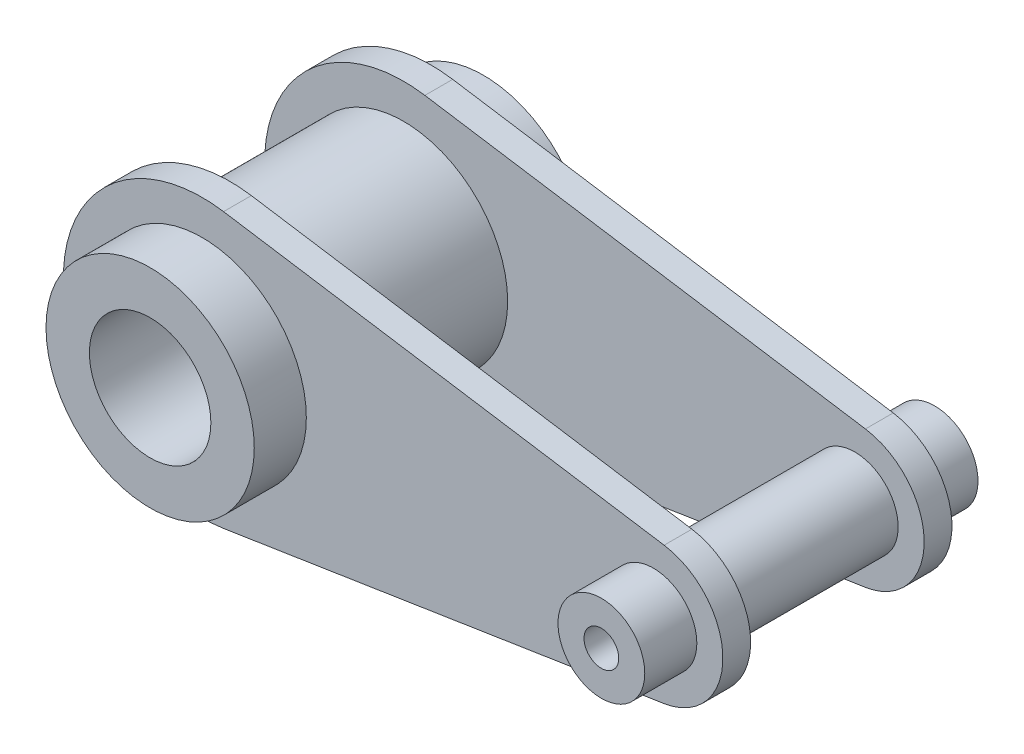
ISO-10303-21;
HEADER;
FILE_DESCRIPTION(('STEP AP214'),'2;1');
FILE_NAME('part.step','',(''),(''),'','','');
FILE_SCHEMA(('AUTOMOTIVE_DESIGN { 1 0 10303 214 1 1 1 1 }'));
ENDSEC;
DATA;
#1=APPLICATION_CONTEXT('core data for automotive mechanical design processes');
#2=APPLICATION_PROTOCOL_DEFINITION('international standard','automotive_design',2000,#1);
#3=PRODUCT_CONTEXT('',#1,'mechanical');
#4=PRODUCT('Part','Part','',(#3));
#5=PRODUCT_RELATED_PRODUCT_CATEGORY('part','',(#4));
#6=PRODUCT_DEFINITION_FORMATION('','',#4);
#7=PRODUCT_DEFINITION_CONTEXT('part definition',#1,'design');
#8=PRODUCT_DEFINITION('design','',#6,#7);
#9=PRODUCT_DEFINITION_SHAPE('','',#8);
#10=(LENGTH_UNIT() NAMED_UNIT(*) SI_UNIT(.MILLI.,.METRE.));
#11=(NAMED_UNIT(*) PLANE_ANGLE_UNIT() SI_UNIT($,.RADIAN.));
#12=(NAMED_UNIT(*) SI_UNIT($,.STERADIAN.) SOLID_ANGLE_UNIT());
#13=UNCERTAINTY_MEASURE_WITH_UNIT(LENGTH_MEASURE(1.E-05),#10,'distance_accuracy_value','');
#14=(GEOMETRIC_REPRESENTATION_CONTEXT(3) GLOBAL_UNCERTAINTY_ASSIGNED_CONTEXT((#13)) GLOBAL_UNIT_ASSIGNED_CONTEXT((#10,
#11,#12)) REPRESENTATION_CONTEXT('',''));
#15=CARTESIAN_POINT('',(0.,0.,0.));
#16=DIRECTION('',(0.,0.,1.));
#17=DIRECTION('',(1.,0.,0.));
#18=AXIS2_PLACEMENT_3D('',#15,#16,#17);
#19=CARTESIAN_POINT('',(-65.,0.,48.));
#20=DIRECTION('',(0.,0.,-1.));
#21=DIRECTION('',(-1.,0.,0.));
#22=AXIS2_PLACEMENT_3D('',#19,#20,#21);
#23=CYLINDRICAL_SURFACE('',#22,30.);
#24=CARTESIAN_POINT('',(-65.,0.,25.));
#25=DIRECTION('',(0.,0.,1.));
#26=DIRECTION('',(1.,0.,0.));
#27=AXIS2_PLACEMENT_3D('',#24,#25,#26);
#28=CIRCLE('',#27,30.);
#29=CARTESIAN_POINT('',(-35.,0.,25.));
#30=VERTEX_POINT('',#29);
#31=EDGE_CURVE('E220',#30,#30,#28,.T.);
#32=ORIENTED_EDGE('',*,*,#31,.F.);
#33=EDGE_LOOP('',(#32));
#34=FACE_BOUND('',#33,.T.);
#35=CARTESIAN_POINT('',(-65.,0.,-25.));
#36=DIRECTION('',(0.,0.,-1.));
#37=DIRECTION('',(-1.,0.,0.));
#38=AXIS2_PLACEMENT_3D('',#35,#36,#37);
#39=CIRCLE('',#38,30.);
#40=CARTESIAN_POINT('',(-95.,0.,-25.));
#41=VERTEX_POINT('',#40);
#42=EDGE_CURVE('E13',#41,#41,#39,.T.);
#43=ORIENTED_EDGE('',*,*,#42,.F.);
#44=EDGE_LOOP('',(#43));
#45=FACE_BOUND('',#44,.T.);
#46=ADVANCED_FACE('F44',(#34,#45),#23,.T.);
#47=CARTESIAN_POINT('',(65.,0.,48.));
#48=DIRECTION('',(0.,0.,-1.));
#49=DIRECTION('',(-1.,0.,0.));
#50=AXIS2_PLACEMENT_3D('',#47,#48,#49);
#51=CYLINDRICAL_SURFACE('',#50,12.5);
#52=CARTESIAN_POINT('',(65.,0.,25.));
#53=DIRECTION('',(0.,0.,1.));
#54=DIRECTION('',(1.,0.,0.));
#55=AXIS2_PLACEMENT_3D('',#52,#53,#54);
#56=CIRCLE('',#55,12.5);
#57=CARTESIAN_POINT('',(77.5,0.,25.));
#58=VERTEX_POINT('',#57);
#59=EDGE_CURVE('E175',#58,#58,#56,.F.);
#60=ORIENTED_EDGE('',*,*,#59,.T.);
#61=EDGE_LOOP('',(#60));
#62=FACE_BOUND('',#61,.T.);
#63=CARTESIAN_POINT('',(65.,0.,-25.));
#64=DIRECTION('',(0.,0.,-1.));
#65=DIRECTION('',(-1.,0.,0.));
#66=AXIS2_PLACEMENT_3D('',#63,#64,#65);
#67=CIRCLE('',#66,12.5);
#68=CARTESIAN_POINT('',(52.5,0.,-25.));
#69=VERTEX_POINT('',#68);
#70=EDGE_CURVE('E53',#69,#69,#67,.T.);
#71=ORIENTED_EDGE('',*,*,#70,.F.);
#72=EDGE_LOOP('',(#71));
#73=FACE_BOUND('',#72,.T.);
#74=ADVANCED_FACE('F228',(#62,#73),#51,.T.);
#75=CARTESIAN_POINT('',(-65.,0.,-33.));
#76=DIRECTION('',(0.,0.,1.));
#77=DIRECTION('',(1.,0.,0.));
#78=AXIS2_PLACEMENT_3D('',#75,#76,#77);
#79=CIRCLE('',#78,30.);
#80=CARTESIAN_POINT('',(-35.,0.,-33.));
#81=VERTEX_POINT('',#80);
#82=EDGE_CURVE('E151',#81,#81,#79,.T.);
#83=ORIENTED_EDGE('',*,*,#82,.F.);
#84=EDGE_LOOP('',(#83));
#85=FACE_BOUND('',#84,.T.);
#86=CARTESIAN_POINT('',(-65.,0.,-48.));
#87=DIRECTION('',(0.,0.,1.));
#88=DIRECTION('',(1.,0.,0.));
#89=AXIS2_PLACEMENT_3D('',#86,#87,#88);
#90=CIRCLE('',#89,30.);
#91=CARTESIAN_POINT('',(-35.,0.,-48.));
#92=VERTEX_POINT('',#91);
#93=EDGE_CURVE('E214',#92,#92,#90,.T.);
#94=ORIENTED_EDGE('',*,*,#93,.T.);
#95=EDGE_LOOP('',(#94));
#96=FACE_BOUND('',#95,.T.);
#97=ADVANCED_FACE('F230',(#85,#96),#23,.T.);
#98=CARTESIAN_POINT('',(-65.,0.,48.));
#99=DIRECTION('',(0.,0.,1.));
#100=DIRECTION('',(1.,0.,0.));
#101=AXIS2_PLACEMENT_3D('',#98,#99,#100);
#102=PLANE('',#101);
#103=CARTESIAN_POINT('',(-65.,0.,48.));
#104=DIRECTION('',(0.,0.,1.));
#105=DIRECTION('',(1.,0.,0.));
#106=AXIS2_PLACEMENT_3D('',#103,#104,#105);
#107=CIRCLE('',#106,30.);
#108=CARTESIAN_POINT('',(-35.,0.,48.));
#109=VERTEX_POINT('',#108);
#110=EDGE_CURVE('E217',#109,#109,#107,.T.);
#111=ORIENTED_EDGE('',*,*,#110,.T.);
#112=EDGE_LOOP('',(#111));
#113=FACE_BOUND('',#112,.T.);
#114=CARTESIAN_POINT('',(-65.,0.,48.));
#115=DIRECTION('',(0.,0.,1.));
#116=DIRECTION('',(1.,0.,0.));
#117=AXIS2_PLACEMENT_3D('',#114,#115,#116);
#118=CIRCLE('',#117,17.5);
#119=CARTESIAN_POINT('',(-47.5,0.,48.));
#120=VERTEX_POINT('',#119);
#121=EDGE_CURVE('E211',#120,#120,#118,.T.);
#122=ORIENTED_EDGE('',*,*,#121,.F.);
#123=EDGE_LOOP('',(#122));
#124=FACE_BOUND('',#123,.T.);
#125=ADVANCED_FACE('F239',(#113,#124),#102,.T.);
#126=CARTESIAN_POINT('',(-65.,0.,-48.));
#127=DIRECTION('',(0.,0.,1.));
#128=DIRECTION('',(1.,0.,0.));
#129=AXIS2_PLACEMENT_3D('',#126,#127,#128);
#130=PLANE('',#129);
#131=ORIENTED_EDGE('',*,*,#93,.F.);
#132=EDGE_LOOP('',(#131));
#133=FACE_BOUND('',#132,.T.);
#134=CARTESIAN_POINT('',(-65.,0.,-48.));
#135=DIRECTION('',(0.,0.,1.));
#136=DIRECTION('',(1.,0.,0.));
#137=AXIS2_PLACEMENT_3D('',#134,#135,#136);
#138=CIRCLE('',#137,17.5);
#139=CARTESIAN_POINT('',(-47.5,0.,-48.));
#140=VERTEX_POINT('',#139);
#141=EDGE_CURVE('E206',#140,#140,#138,.T.);
#142=ORIENTED_EDGE('',*,*,#141,.T.);
#143=EDGE_LOOP('',(#142));
#144=FACE_BOUND('',#143,.T.);
#145=ADVANCED_FACE('F428',(#133,#144),#130,.F.);
#146=CARTESIAN_POINT('',(-65.,0.,33.));
#147=DIRECTION('',(0.,0.,1.));
#148=DIRECTION('',(1.,0.,0.));
#149=AXIS2_PLACEMENT_3D('',#146,#147,#148);
#150=CIRCLE('',#149,30.);
#151=CARTESIAN_POINT('',(-35.,0.,33.));
#152=VERTEX_POINT('',#151);
#153=EDGE_CURVE('E183',#152,#152,#150,.T.);
#154=ORIENTED_EDGE('',*,*,#153,.T.);
#155=EDGE_LOOP('',(#154));
#156=FACE_BOUND('',#155,.T.);
#157=ORIENTED_EDGE('',*,*,#110,.F.);
#158=EDGE_LOOP('',(#157));
#159=FACE_BOUND('',#158,.T.);
#160=ADVANCED_FACE('F46',(#156,#159),#23,.T.);
#161=CARTESIAN_POINT('',(-65.,0.,48.));
#162=DIRECTION('',(0.,0.,-1.));
#163=DIRECTION('',(-1.,0.,0.));
#164=AXIS2_PLACEMENT_3D('',#161,#162,#163);
#165=CYLINDRICAL_SURFACE('',#164,17.5);
#166=ORIENTED_EDGE('',*,*,#121,.T.);
#167=EDGE_LOOP('',(#166));
#168=FACE_BOUND('',#167,.T.);
#169=ORIENTED_EDGE('',*,*,#141,.F.);
#170=EDGE_LOOP('',(#169));
#171=FACE_BOUND('',#170,.T.);
#172=ADVANCED_FACE('F386',(#168,#171),#165,.F.);
#173=CARTESIAN_POINT('',(-65.,0.,25.));
#174=DIRECTION('',(0.,0.,1.));
#175=DIRECTION('',(1.,0.,0.));
#176=AXIS2_PLACEMENT_3D('',#173,#174,#175);
#177=CYLINDRICAL_SURFACE('',#176,40.);
#178=CARTESIAN_POINT('',(-65.,0.,33.));
#179=DIRECTION('',(0.,0.,1.));
#180=DIRECTION('',(1.,0.,0.));
#181=AXIS2_PLACEMENT_3D('',#178,#179,#180);
#182=CIRCLE('',#181,40.);
#183=CARTESIAN_POINT('',(-58.8461538461539,39.5237925497389,33.));
#184=VERTEX_POINT('',#183);
#185=CARTESIAN_POINT('',(-58.8461538461538,-39.5237925497389,33.));
#186=VERTEX_POINT('',#185);
#187=EDGE_CURVE('E186',#184,#186,#182,.T.);
#188=ORIENTED_EDGE('',*,*,#187,.F.);
#189=DIRECTION('',(0.,0.,1.));
#190=VECTOR('',#189,1.);
#191=CARTESIAN_POINT('',(-58.8461538461539,39.5237925497389,25.));
#192=LINE('',#191,#190);
#193=CARTESIAN_POINT('',(-58.8461538461539,39.5237925497389,25.));
#194=VERTEX_POINT('',#193);
#195=EDGE_CURVE('E61',#194,#184,#192,.T.);
#196=ORIENTED_EDGE('',*,*,#195,.F.);
#197=CARTESIAN_POINT('',(-65.,0.,25.));
#198=DIRECTION('',(0.,0.,1.));
#199=DIRECTION('',(1.,0.,0.));
#200=AXIS2_PLACEMENT_3D('',#197,#198,#199);
#201=CIRCLE('',#200,40.);
#202=CARTESIAN_POINT('',(-58.8461538461538,-39.5237925497389,25.));
#203=VERTEX_POINT('',#202);
#204=EDGE_CURVE('E187',#194,#203,#201,.T.);
#205=ORIENTED_EDGE('',*,*,#204,.T.);
#206=DIRECTION('',(0.,0.,1.));
#207=VECTOR('',#206,1.);
#208=CARTESIAN_POINT('',(-58.8461538461538,-39.5237925497389,25.));
#209=LINE('',#208,#207);
#210=EDGE_CURVE('E90',#203,#186,#209,.T.);
#211=ORIENTED_EDGE('',*,*,#210,.T.);
#212=EDGE_LOOP('',(#188,#196,#205,#211));
#213=FACE_BOUND('',#212,.T.);
#214=ADVANCED_FACE('F378',(#213),#177,.T.);
#215=CARTESIAN_POINT('',(68.0769230769231,19.7618962748695,25.));
#216=DIRECTION('',(0.153846153846154,0.988094813743472,0.));
#217=DIRECTION('',(-0.988094813743472,0.153846153846154,0.));
#218=AXIS2_PLACEMENT_3D('',#215,#216,#217);
#219=PLANE('',#218);
#220=DIRECTION('',(-0.988094813743472,0.153846153846154,0.));
#221=VECTOR('',#220,1.);
#222=CARTESIAN_POINT('',(68.0769230769231,19.7618962748695,33.));
#223=LINE('',#222,#221);
#224=CARTESIAN_POINT('',(68.0769230769231,19.7618962748695,33.));
#225=VERTEX_POINT('',#224);
#226=EDGE_CURVE('E190',#225,#184,#223,.T.);
#227=ORIENTED_EDGE('',*,*,#226,.F.);
#228=DIRECTION('',(0.,0.,1.));
#229=VECTOR('',#228,1.);
#230=CARTESIAN_POINT('',(68.0769230769231,19.7618962748695,25.));
#231=LINE('',#230,#229);
#232=CARTESIAN_POINT('',(68.0769230769231,19.7618962748695,25.));
#233=VERTEX_POINT('',#232);
#234=EDGE_CURVE('E79',#233,#225,#231,.T.);
#235=ORIENTED_EDGE('',*,*,#234,.F.);
#236=DIRECTION('',(-0.988094813743472,0.153846153846154,0.));
#237=VECTOR('',#236,1.);
#238=CARTESIAN_POINT('',(68.0769230769231,19.7618962748695,25.));
#239=LINE('',#238,#237);
#240=EDGE_CURVE('E194',#233,#194,#239,.T.);
#241=ORIENTED_EDGE('',*,*,#240,.T.);
#242=ORIENTED_EDGE('',*,*,#195,.T.);
#243=EDGE_LOOP('',(#227,#235,#241,#242));
#244=FACE_BOUND('',#243,.T.);
#245=ADVANCED_FACE('F370',(#244),#219,.T.);
#246=CARTESIAN_POINT('',(65.,0.,25.));
#247=DIRECTION('',(0.,0.,1.));
#248=DIRECTION('',(1.,0.,0.));
#249=AXIS2_PLACEMENT_3D('',#246,#247,#248);
#250=CYLINDRICAL_SURFACE('',#249,20.);
#251=CARTESIAN_POINT('',(65.,0.,33.));
#252=DIRECTION('',(0.,0.,1.));
#253=DIRECTION('',(1.,0.,0.));
#254=AXIS2_PLACEMENT_3D('',#251,#252,#253);
#255=CIRCLE('',#254,20.);
#256=CARTESIAN_POINT('',(68.0769230769231,-19.7618962748694,33.));
#257=VERTEX_POINT('',#256);
#258=EDGE_CURVE('E201',#257,#225,#255,.T.);
#259=ORIENTED_EDGE('',*,*,#258,.F.);
#260=DIRECTION('',(0.,0.,1.));
#261=VECTOR('',#260,1.);
#262=CARTESIAN_POINT('',(68.0769230769231,-19.7618962748694,25.));
#263=LINE('',#262,#261);
#264=CARTESIAN_POINT('',(68.0769230769231,-19.7618962748694,25.));
#265=VERTEX_POINT('',#264);
#266=EDGE_CURVE('E208',#265,#257,#263,.T.);
#267=ORIENTED_EDGE('',*,*,#266,.F.);
#268=CARTESIAN_POINT('',(65.,0.,25.));
#269=DIRECTION('',(0.,0.,1.));
#270=DIRECTION('',(1.,0.,0.));
#271=AXIS2_PLACEMENT_3D('',#268,#269,#270);
#272=CIRCLE('',#271,20.);
#273=EDGE_CURVE('E192',#265,#233,#272,.T.);
#274=ORIENTED_EDGE('',*,*,#273,.T.);
#275=ORIENTED_EDGE('',*,*,#234,.T.);
#276=EDGE_LOOP('',(#259,#267,#274,#275));
#277=FACE_BOUND('',#276,.T.);
#278=ADVANCED_FACE('F362',(#277),#250,.T.);
#279=CARTESIAN_POINT('',(68.0769230769231,-19.7618962748694,25.));
#280=DIRECTION('',(0.153846153846154,-0.988094813743472,0.));
#281=DIRECTION('',(0.988094813743471,0.153846153846154,0.));
#282=AXIS2_PLACEMENT_3D('',#279,#280,#281);
#283=PLANE('',#282);
#284=DIRECTION('',(0.988094813743471,0.153846153846154,0.));
#285=VECTOR('',#284,1.);
#286=CARTESIAN_POINT('',(68.0769230769231,-19.7618962748694,33.));
#287=LINE('',#286,#285);
#288=EDGE_CURVE('E198',#186,#257,#287,.T.);
#289=ORIENTED_EDGE('',*,*,#288,.F.);
#290=ORIENTED_EDGE('',*,*,#210,.F.);
#291=DIRECTION('',(0.988094813743471,0.153846153846154,0.));
#292=VECTOR('',#291,1.);
#293=CARTESIAN_POINT('',(68.0769230769231,-19.7618962748694,25.));
#294=LINE('',#293,#292);
#295=EDGE_CURVE('E189',#203,#265,#294,.T.);
#296=ORIENTED_EDGE('',*,*,#295,.T.);
#297=ORIENTED_EDGE('',*,*,#266,.T.);
#298=EDGE_LOOP('',(#289,#290,#296,#297));
#299=FACE_BOUND('',#298,.T.);
#300=ADVANCED_FACE('F354',(#299),#283,.T.);
#301=CARTESIAN_POINT('',(-65.,0.,25.));
#302=DIRECTION('',(0.,0.,1.));
#303=DIRECTION('',(1.,0.,0.));
#304=AXIS2_PLACEMENT_3D('',#301,#302,#303);
#305=PLANE('',#304);
#306=ORIENTED_EDGE('',*,*,#59,.F.);
#307=EDGE_LOOP('',(#306));
#308=FACE_BOUND('',#307,.T.);
#309=ORIENTED_EDGE('',*,*,#31,.T.);
#310=EDGE_LOOP('',(#309));
#311=FACE_BOUND('',#310,.T.);
#312=ORIENTED_EDGE('',*,*,#204,.F.);
#313=ORIENTED_EDGE('',*,*,#240,.F.);
#314=ORIENTED_EDGE('',*,*,#273,.F.);
#315=ORIENTED_EDGE('',*,*,#295,.F.);
#316=EDGE_LOOP('',(#312,#313,#314,#315));
#317=FACE_BOUND('',#316,.T.);
#318=ADVANCED_FACE('F345',(#308,#311,#317),#305,.F.);
#319=CARTESIAN_POINT('',(-65.,0.,33.));
#320=DIRECTION('',(0.,0.,1.));
#321=DIRECTION('',(1.,0.,0.));
#322=AXIS2_PLACEMENT_3D('',#319,#320,#321);
#323=PLANE('',#322);
#324=CARTESIAN_POINT('',(65.,0.,33.));
#325=DIRECTION('',(0.,0.,1.));
#326=DIRECTION('',(1.,0.,0.));
#327=AXIS2_PLACEMENT_3D('',#324,#325,#326);
#328=CIRCLE('',#327,12.5);
#329=CARTESIAN_POINT('',(77.5,0.,33.));
#330=VERTEX_POINT('',#329);
#331=EDGE_CURVE('E180',#330,#330,#328,.T.);
#332=ORIENTED_EDGE('',*,*,#331,.F.);
#333=EDGE_LOOP('',(#332));
#334=FACE_BOUND('',#333,.T.);
#335=ORIENTED_EDGE('',*,*,#153,.F.);
#336=EDGE_LOOP('',(#335));
#337=FACE_BOUND('',#336,.T.);
#338=ORIENTED_EDGE('',*,*,#187,.T.);
#339=ORIENTED_EDGE('',*,*,#288,.T.);
#340=ORIENTED_EDGE('',*,*,#258,.T.);
#341=ORIENTED_EDGE('',*,*,#226,.T.);
#342=EDGE_LOOP('',(#338,#339,#340,#341));
#343=FACE_BOUND('',#342,.T.);
#344=ADVANCED_FACE('F246',(#334,#337,#343),#323,.T.);
#345=CARTESIAN_POINT('',(65.,0.,-33.));
#346=DIRECTION('',(0.,0.,1.));
#347=DIRECTION('',(1.,0.,0.));
#348=AXIS2_PLACEMENT_3D('',#345,#346,#347);
#349=CIRCLE('',#348,12.5);
#350=CARTESIAN_POINT('',(77.5,0.,-33.));
#351=VERTEX_POINT('',#350);
#352=EDGE_CURVE('E484',#351,#351,#349,.T.);
#353=ORIENTED_EDGE('',*,*,#352,.F.);
#354=EDGE_LOOP('',(#353));
#355=FACE_BOUND('',#354,.T.);
#356=CARTESIAN_POINT('',(65.,0.,-48.));
#357=DIRECTION('',(0.,0.,1.));
#358=DIRECTION('',(1.,0.,0.));
#359=AXIS2_PLACEMENT_3D('',#356,#357,#358);
#360=CIRCLE('',#359,12.5);
#361=CARTESIAN_POINT('',(77.5,0.,-48.));
#362=VERTEX_POINT('',#361);
#363=EDGE_CURVE('E169',#362,#362,#360,.T.);
#364=ORIENTED_EDGE('',*,*,#363,.T.);
#365=EDGE_LOOP('',(#364));
#366=FACE_BOUND('',#365,.T.);
#367=ADVANCED_FACE('F233',(#355,#366),#51,.T.);
#368=CARTESIAN_POINT('',(65.,0.,48.));
#369=DIRECTION('',(0.,0.,1.));
#370=DIRECTION('',(1.,0.,0.));
#371=AXIS2_PLACEMENT_3D('',#368,#369,#370);
#372=PLANE('',#371);
#373=CARTESIAN_POINT('',(65.,0.,48.));
#374=DIRECTION('',(0.,0.,1.));
#375=DIRECTION('',(1.,0.,0.));
#376=AXIS2_PLACEMENT_3D('',#373,#374,#375);
#377=CIRCLE('',#376,12.5);
#378=CARTESIAN_POINT('',(77.5,0.,48.));
#379=VERTEX_POINT('',#378);
#380=EDGE_CURVE('E172',#379,#379,#377,.T.);
#381=ORIENTED_EDGE('',*,*,#380,.T.);
#382=EDGE_LOOP('',(#381));
#383=FACE_BOUND('',#382,.T.);
#384=CARTESIAN_POINT('',(65.,0.,48.));
#385=DIRECTION('',(0.,0.,1.));
#386=DIRECTION('',(1.,0.,0.));
#387=AXIS2_PLACEMENT_3D('',#384,#385,#386);
#388=CIRCLE('',#387,5.);
#389=CARTESIAN_POINT('',(70.,0.,48.));
#390=VERTEX_POINT('',#389);
#391=EDGE_CURVE('E166',#390,#390,#388,.T.);
#392=ORIENTED_EDGE('',*,*,#391,.F.);
#393=EDGE_LOOP('',(#392));
#394=FACE_BOUND('',#393,.T.);
#395=ADVANCED_FACE('F245',(#383,#394),#372,.T.);
#396=CARTESIAN_POINT('',(65.,0.,-48.));
#397=DIRECTION('',(0.,0.,1.));
#398=DIRECTION('',(1.,0.,0.));
#399=AXIS2_PLACEMENT_3D('',#396,#397,#398);
#400=PLANE('',#399);
#401=ORIENTED_EDGE('',*,*,#363,.F.);
#402=EDGE_LOOP('',(#401));
#403=FACE_BOUND('',#402,.T.);
#404=CARTESIAN_POINT('',(65.,0.,-48.));
#405=DIRECTION('',(0.,0.,1.));
#406=DIRECTION('',(1.,0.,0.));
#407=AXIS2_PLACEMENT_3D('',#404,#405,#406);
#408=CIRCLE('',#407,5.);
#409=CARTESIAN_POINT('',(70.,0.,-48.));
#410=VERTEX_POINT('',#409);
#411=EDGE_CURVE('E161',#410,#410,#408,.T.);
#412=ORIENTED_EDGE('',*,*,#411,.T.);
#413=EDGE_LOOP('',(#412));
#414=FACE_BOUND('',#413,.T.);
#415=ADVANCED_FACE('F250',(#403,#414),#400,.F.);
#416=ORIENTED_EDGE('',*,*,#331,.T.);
#417=EDGE_LOOP('',(#416));
#418=FACE_BOUND('',#417,.T.);
#419=ORIENTED_EDGE('',*,*,#380,.F.);
#420=EDGE_LOOP('',(#419));
#421=FACE_BOUND('',#420,.T.);
#422=ADVANCED_FACE('F234',(#418,#421),#51,.T.);
#423=CARTESIAN_POINT('',(65.,0.,48.));
#424=DIRECTION('',(0.,0.,-1.));
#425=DIRECTION('',(-1.,0.,0.));
#426=AXIS2_PLACEMENT_3D('',#423,#424,#425);
#427=CYLINDRICAL_SURFACE('',#426,5.);
#428=ORIENTED_EDGE('',*,*,#391,.T.);
#429=EDGE_LOOP('',(#428));
#430=FACE_BOUND('',#429,.T.);
#431=ORIENTED_EDGE('',*,*,#411,.F.);
#432=EDGE_LOOP('',(#431));
#433=FACE_BOUND('',#432,.T.);
#434=ADVANCED_FACE('F249',(#430,#433),#427,.F.);
#435=CARTESIAN_POINT('',(-65.,0.,-25.));
#436=DIRECTION('',(0.,0.,-1.));
#437=DIRECTION('',(1.,0.,0.));
#438=AXIS2_PLACEMENT_3D('',#435,#436,#437);
#439=PLANE('',#438);
#440=CARTESIAN_POINT('',(-65.,0.,-25.));
#441=DIRECTION('',(0.,0.,1.));
#442=DIRECTION('',(1.,0.,0.));
#443=AXIS2_PLACEMENT_3D('',#440,#441,#442);
#444=CIRCLE('',#443,40.);
#445=CARTESIAN_POINT('',(-58.8461538461539,39.5237925497389,-25.));
#446=VERTEX_POINT('',#445);
#447=CARTESIAN_POINT('',(-58.8461538461538,-39.5237925497389,-25.));
#448=VERTEX_POINT('',#447);
#449=EDGE_CURVE('E124',#446,#448,#444,.T.);
#450=ORIENTED_EDGE('',*,*,#449,.T.);
#451=DIRECTION('',(0.988094813743471,0.153846153846154,0.));
#452=VECTOR('',#451,1.);
#453=CARTESIAN_POINT('',(68.0769230769231,-19.7618962748694,-25.));
#454=LINE('',#453,#452);
#455=CARTESIAN_POINT('',(68.0769230769231,-19.7618962748694,-25.));
#456=VERTEX_POINT('',#455);
#457=EDGE_CURVE('E141',#448,#456,#454,.T.);
#458=ORIENTED_EDGE('',*,*,#457,.T.);
#459=CARTESIAN_POINT('',(65.,0.,-25.));
#460=DIRECTION('',(0.,0.,1.));
#461=DIRECTION('',(1.,0.,0.));
#462=AXIS2_PLACEMENT_3D('',#459,#460,#461);
#463=CIRCLE('',#462,20.);
#464=CARTESIAN_POINT('',(68.0769230769231,19.7618962748695,-25.));
#465=VERTEX_POINT('',#464);
#466=EDGE_CURVE('E127',#456,#465,#463,.T.);
#467=ORIENTED_EDGE('',*,*,#466,.T.);
#468=DIRECTION('',(-0.988094813743472,0.153846153846154,0.));
#469=VECTOR('',#468,1.);
#470=CARTESIAN_POINT('',(68.0769230769231,19.7618962748695,-25.));
#471=LINE('',#470,#469);
#472=EDGE_CURVE('E119',#465,#446,#471,.T.);
#473=ORIENTED_EDGE('',*,*,#472,.T.);
#474=EDGE_LOOP('',(#450,#458,#467,#473));
#475=FACE_BOUND('',#474,.T.);
#476=ORIENTED_EDGE('',*,*,#42,.T.);
#477=EDGE_LOOP('',(#476));
#478=FACE_BOUND('',#477,.T.);
#479=ORIENTED_EDGE('',*,*,#70,.T.);
#480=EDGE_LOOP('',(#479));
#481=FACE_BOUND('',#480,.T.);
#482=ADVANCED_FACE('F121',(#475,#478,#481),#439,.F.);
#483=CARTESIAN_POINT('',(-65.,0.,-33.));
#484=DIRECTION('',(0.,0.,-1.));
#485=DIRECTION('',(1.,0.,0.));
#486=AXIS2_PLACEMENT_3D('',#483,#484,#485);
#487=PLANE('',#486);
#488=ORIENTED_EDGE('',*,*,#82,.T.);
#489=EDGE_LOOP('',(#488));
#490=FACE_BOUND('',#489,.T.);
#491=CARTESIAN_POINT('',(-65.,0.,-33.));
#492=DIRECTION('',(0.,0.,1.));
#493=DIRECTION('',(1.,0.,0.));
#494=AXIS2_PLACEMENT_3D('',#491,#492,#493);
#495=CIRCLE('',#494,40.);
#496=CARTESIAN_POINT('',(-58.8461538461539,39.5237925497389,-33.));
#497=VERTEX_POINT('',#496);
#498=CARTESIAN_POINT('',(-58.8461538461538,-39.5237925497389,-33.));
#499=VERTEX_POINT('',#498);
#500=EDGE_CURVE('E156',#497,#499,#495,.T.);
#501=ORIENTED_EDGE('',*,*,#500,.F.);
#502=DIRECTION('',(-0.988094813743472,0.153846153846154,0.));
#503=VECTOR('',#502,1.);
#504=CARTESIAN_POINT('',(68.0769230769231,19.7618962748695,-33.));
#505=LINE('',#504,#503);
#506=CARTESIAN_POINT('',(68.0769230769231,19.7618962748695,-33.));
#507=VERTEX_POINT('',#506);
#508=EDGE_CURVE('E136',#507,#497,#505,.T.);
#509=ORIENTED_EDGE('',*,*,#508,.F.);
#510=CARTESIAN_POINT('',(65.,0.,-33.));
#511=DIRECTION('',(0.,0.,1.));
#512=DIRECTION('',(1.,0.,0.));
#513=AXIS2_PLACEMENT_3D('',#510,#511,#512);
#514=CIRCLE('',#513,20.);
#515=CARTESIAN_POINT('',(68.0769230769231,-19.7618962748694,-33.));
#516=VERTEX_POINT('',#515);
#517=EDGE_CURVE('E148',#516,#507,#514,.T.);
#518=ORIENTED_EDGE('',*,*,#517,.F.);
#519=DIRECTION('',(0.988094813743471,0.153846153846154,0.));
#520=VECTOR('',#519,1.);
#521=CARTESIAN_POINT('',(68.0769230769231,-19.7618962748694,-33.));
#522=LINE('',#521,#520);
#523=EDGE_CURVE('E146',#499,#516,#522,.T.);
#524=ORIENTED_EDGE('',*,*,#523,.F.);
#525=EDGE_LOOP('',(#501,#509,#518,#524));
#526=FACE_BOUND('',#525,.T.);
#527=ORIENTED_EDGE('',*,*,#352,.T.);
#528=EDGE_LOOP('',(#527));
#529=FACE_BOUND('',#528,.T.);
#530=ADVANCED_FACE('F276',(#490,#526,#529),#487,.T.);
#531=CARTESIAN_POINT('',(-65.,0.,-25.));
#532=DIRECTION('',(0.,0.,-1.));
#533=DIRECTION('',(-1.,0.,0.));
#534=AXIS2_PLACEMENT_3D('',#531,#532,#533);
#535=CYLINDRICAL_SURFACE('',#534,40.);
#536=ORIENTED_EDGE('',*,*,#500,.T.);
#537=DIRECTION('',(0.,0.,-1.));
#538=VECTOR('',#537,1.);
#539=CARTESIAN_POINT('',(-58.8461538461538,-39.5237925497389,-25.));
#540=LINE('',#539,#538);
#541=EDGE_CURVE('E145',#448,#499,#540,.T.);
#542=ORIENTED_EDGE('',*,*,#541,.F.);
#543=ORIENTED_EDGE('',*,*,#449,.F.);
#544=DIRECTION('',(0.,0.,-1.));
#545=VECTOR('',#544,1.);
#546=CARTESIAN_POINT('',(-58.8461538461539,39.5237925497389,-25.));
#547=LINE('',#546,#545);
#548=EDGE_CURVE('E133',#446,#497,#547,.T.);
#549=ORIENTED_EDGE('',*,*,#548,.T.);
#550=EDGE_LOOP('',(#536,#542,#543,#549));
#551=FACE_BOUND('',#550,.T.);
#552=ADVANCED_FACE('F143',(#551),#535,.T.);
#553=CARTESIAN_POINT('',(68.0769230769231,-19.7618962748694,-25.));
#554=DIRECTION('',(-0.153846153846154,0.988094813743472,0.));
#555=DIRECTION('',(-0.988094813743471,-0.153846153846154,0.));
#556=AXIS2_PLACEMENT_3D('',#553,#554,#555);
#557=PLANE('',#556);
#558=ORIENTED_EDGE('',*,*,#523,.T.);
#559=DIRECTION('',(0.,0.,-1.));
#560=VECTOR('',#559,1.);
#561=CARTESIAN_POINT('',(68.0769230769231,-19.7618962748694,-25.));
#562=LINE('',#561,#560);
#563=EDGE_CURVE('E162',#456,#516,#562,.T.);
#564=ORIENTED_EDGE('',*,*,#563,.F.);
#565=ORIENTED_EDGE('',*,*,#457,.F.);
#566=ORIENTED_EDGE('',*,*,#541,.T.);
#567=EDGE_LOOP('',(#558,#564,#565,#566));
#568=FACE_BOUND('',#567,.T.);
#569=ADVANCED_FACE('F275',(#568),#557,.F.);
#570=CARTESIAN_POINT('',(65.,0.,-25.));
#571=DIRECTION('',(0.,0.,-1.));
#572=DIRECTION('',(-1.,0.,0.));
#573=AXIS2_PLACEMENT_3D('',#570,#571,#572);
#574=CYLINDRICAL_SURFACE('',#573,20.);
#575=ORIENTED_EDGE('',*,*,#517,.T.);
#576=DIRECTION('',(0.,0.,-1.));
#577=VECTOR('',#576,1.);
#578=CARTESIAN_POINT('',(68.0769230769231,19.7618962748695,-25.));
#579=LINE('',#578,#577);
#580=EDGE_CURVE('E140',#465,#507,#579,.T.);
#581=ORIENTED_EDGE('',*,*,#580,.F.);
#582=ORIENTED_EDGE('',*,*,#466,.F.);
#583=ORIENTED_EDGE('',*,*,#563,.T.);
#584=EDGE_LOOP('',(#575,#581,#582,#583));
#585=FACE_BOUND('',#584,.T.);
#586=ADVANCED_FACE('F279',(#585),#574,.T.);
#587=CARTESIAN_POINT('',(68.0769230769231,19.7618962748695,-25.));
#588=DIRECTION('',(-0.153846153846154,-0.988094813743472,0.));
#589=DIRECTION('',(0.988094813743472,-0.153846153846154,0.));
#590=AXIS2_PLACEMENT_3D('',#587,#588,#589);
#591=PLANE('',#590);
#592=ORIENTED_EDGE('',*,*,#508,.T.);
#593=ORIENTED_EDGE('',*,*,#548,.F.);
#594=ORIENTED_EDGE('',*,*,#472,.F.);
#595=ORIENTED_EDGE('',*,*,#580,.T.);
#596=EDGE_LOOP('',(#592,#593,#594,#595));
#597=FACE_BOUND('',#596,.T.);
#598=ADVANCED_FACE('F134',(#597),#591,.F.);
#599=CLOSED_SHELL('',(#46,#74,#97,#125,#145,#160,#172,#214,#245,#278,#300,#318,#344,#367,#395,
#415,#422,#434,#482,#530,#552,#569,#586,#598));
#600=MANIFOLD_SOLID_BREP('B2',#599);
#601=ADVANCED_BREP_SHAPE_REPRESENTATION('',(#18,#600),#14);
#602=SHAPE_DEFINITION_REPRESENTATION(#9,#601);
ENDSEC;
END-ISO-10303-21;
